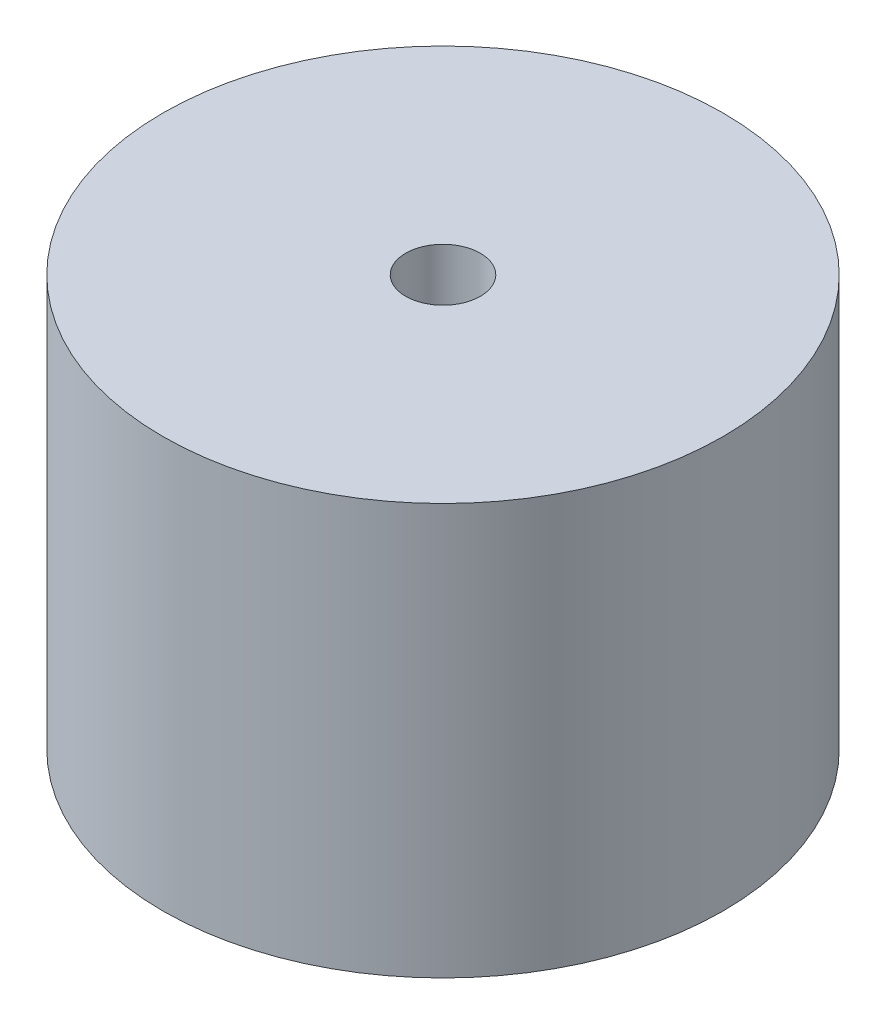
ISO-10303-21;
HEADER;
FILE_DESCRIPTION(('STEP AP214'),'2;1');
FILE_NAME('part.step','',(''),(''),'','','');
FILE_SCHEMA(('AUTOMOTIVE_DESIGN { 1 0 10303 214 1 1 1 1 }'));
ENDSEC;
DATA;
#1=APPLICATION_CONTEXT('core data for automotive mechanical design processes');
#2=APPLICATION_PROTOCOL_DEFINITION('international standard','automotive_design',2000,#1);
#3=PRODUCT_CONTEXT('',#1,'mechanical');
#4=PRODUCT('Part','Part','',(#3));
#5=PRODUCT_RELATED_PRODUCT_CATEGORY('part','',(#4));
#6=PRODUCT_DEFINITION_FORMATION('','',#4);
#7=PRODUCT_DEFINITION_CONTEXT('part definition',#1,'design');
#8=PRODUCT_DEFINITION('design','',#6,#7);
#9=PRODUCT_DEFINITION_SHAPE('','',#8);
#10=(LENGTH_UNIT() NAMED_UNIT(*) SI_UNIT(.MILLI.,.METRE.));
#11=(NAMED_UNIT(*) PLANE_ANGLE_UNIT() SI_UNIT($,.RADIAN.));
#12=(NAMED_UNIT(*) SI_UNIT($,.STERADIAN.) SOLID_ANGLE_UNIT());
#13=UNCERTAINTY_MEASURE_WITH_UNIT(LENGTH_MEASURE(1.E-05),#10,'distance_accuracy_value','');
#14=(GEOMETRIC_REPRESENTATION_CONTEXT(3) GLOBAL_UNCERTAINTY_ASSIGNED_CONTEXT((#13)) GLOBAL_UNIT_ASSIGNED_CONTEXT((#10,
#11,#12)) REPRESENTATION_CONTEXT('',''));
#15=CARTESIAN_POINT('',(0.,0.,0.));
#16=DIRECTION('',(0.,0.,1.));
#17=DIRECTION('',(1.,0.,0.));
#18=AXIS2_PLACEMENT_3D('',#15,#16,#17);
#19=CARTESIAN_POINT('',(0.,22.,0.));
#20=DIRECTION('',(0.,-1.,0.));
#21=DIRECTION('',(0.,0.,-1.));
#22=AXIS2_PLACEMENT_3D('',#19,#20,#21);
#23=CYLINDRICAL_SURFACE('',#22,15.);
#24=CARTESIAN_POINT('',(0.,22.,0.));
#25=DIRECTION('',(0.,1.,0.));
#26=DIRECTION('',(0.,0.,1.));
#27=AXIS2_PLACEMENT_3D('',#24,#25,#26);
#28=CIRCLE('',#27,15.);
#29=CARTESIAN_POINT('',(0.,22.,15.));
#30=VERTEX_POINT('',#29);
#31=EDGE_CURVE('E10',#30,#30,#28,.T.);
#32=ORIENTED_EDGE('',*,*,#31,.F.);
#33=EDGE_LOOP('',(#32));
#34=FACE_BOUND('',#33,.T.);
#35=CARTESIAN_POINT('',(0.,0.,0.));
#36=DIRECTION('',(0.,1.,0.));
#37=DIRECTION('',(0.,0.,1.));
#38=AXIS2_PLACEMENT_3D('',#35,#36,#37);
#39=CIRCLE('',#38,15.);
#40=CARTESIAN_POINT('',(0.,0.,15.));
#41=VERTEX_POINT('',#40);
#42=EDGE_CURVE('E44',#41,#41,#39,.T.);
#43=ORIENTED_EDGE('',*,*,#42,.T.);
#44=EDGE_LOOP('',(#43));
#45=FACE_BOUND('',#44,.T.);
#46=ADVANCED_FACE('F41',(#34,#45),#23,.T.);
#47=CARTESIAN_POINT('',(0.,22.,0.));
#48=DIRECTION('',(0.,1.,0.));
#49=DIRECTION('',(0.,0.,1.));
#50=AXIS2_PLACEMENT_3D('',#47,#48,#49);
#51=PLANE('',#50);
#52=CARTESIAN_POINT('',(0.,22.,0.));
#53=DIRECTION('',(0.,1.,0.));
#54=DIRECTION('',(0.,0.,1.));
#55=AXIS2_PLACEMENT_3D('',#52,#53,#54);
#56=CIRCLE('',#55,2.);
#57=CARTESIAN_POINT('',(0.,22.,2.));
#58=VERTEX_POINT('',#57);
#59=EDGE_CURVE('E55',#58,#58,#56,.T.);
#60=ORIENTED_EDGE('',*,*,#59,.F.);
#61=EDGE_LOOP('',(#60));
#62=FACE_BOUND('',#61,.T.);
#63=ORIENTED_EDGE('',*,*,#31,.T.);
#64=EDGE_LOOP('',(#63));
#65=FACE_BOUND('',#64,.T.);
#66=ADVANCED_FACE('F72',(#62,#65),#51,.T.);
#67=CARTESIAN_POINT('',(0.,0.,0.));
#68=DIRECTION('',(0.,1.,0.));
#69=DIRECTION('',(0.,0.,1.));
#70=AXIS2_PLACEMENT_3D('',#67,#68,#69);
#71=PLANE('',#70);
#72=ORIENTED_EDGE('',*,*,#42,.F.);
#73=EDGE_LOOP('',(#72));
#74=FACE_BOUND('',#73,.T.);
#75=ADVANCED_FACE('F68',(#74),#71,.F.);
#76=CARTESIAN_POINT('',(0.,17.,0.));
#77=DIRECTION('',(0.,1.,0.));
#78=DIRECTION('',(0.,0.,1.));
#79=AXIS2_PLACEMENT_3D('',#76,#77,#78);
#80=CYLINDRICAL_SURFACE('',#79,2.);
#81=CARTESIAN_POINT('',(0.,17.,0.));
#82=DIRECTION('',(0.,1.,0.));
#83=DIRECTION('',(0.,0.,1.));
#84=AXIS2_PLACEMENT_3D('',#81,#82,#83);
#85=CIRCLE('',#84,2.);
#86=CARTESIAN_POINT('',(0.,17.,2.));
#87=VERTEX_POINT('',#86);
#88=EDGE_CURVE('E53',#87,#87,#85,.T.);
#89=ORIENTED_EDGE('',*,*,#88,.F.);
#90=EDGE_LOOP('',(#89));
#91=FACE_BOUND('',#90,.T.);
#92=ORIENTED_EDGE('',*,*,#59,.T.);
#93=EDGE_LOOP('',(#92));
#94=FACE_BOUND('',#93,.T.);
#95=ADVANCED_FACE('F65',(#91,#94),#80,.F.);
#96=CARTESIAN_POINT('',(0.,17.,0.));
#97=DIRECTION('',(0.,1.,0.));
#98=DIRECTION('',(0.,0.,1.));
#99=AXIS2_PLACEMENT_3D('',#96,#97,#98);
#100=PLANE('',#99);
#101=ORIENTED_EDGE('',*,*,#88,.T.);
#102=EDGE_LOOP('',(#101));
#103=FACE_BOUND('',#102,.T.);
#104=ADVANCED_FACE('F63',(#103),#100,.T.);
#105=CLOSED_SHELL('',(#46,#66,#75,#95,#104));
#106=MANIFOLD_SOLID_BREP('B2',#105);
#107=ADVANCED_BREP_SHAPE_REPRESENTATION('',(#18,#106),#14);
#108=SHAPE_DEFINITION_REPRESENTATION(#9,#107);
ENDSEC;
END-ISO-10303-21;
